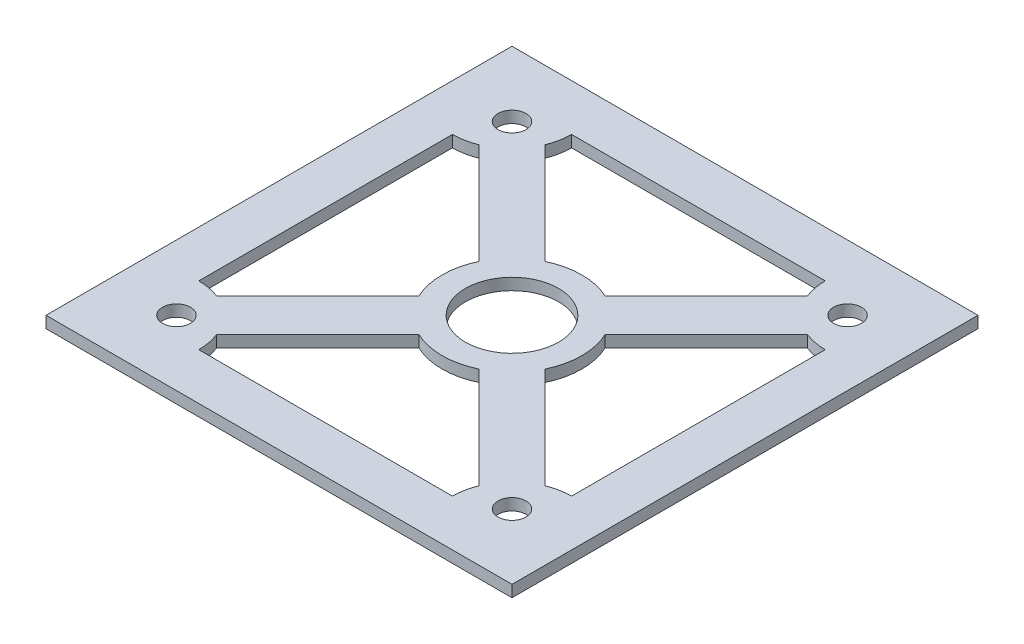
ISO-10303-21;
HEADER;
FILE_DESCRIPTION(('STEP AP214'),'2;1');
FILE_NAME('part.step','',(''),(''),'','','');
FILE_SCHEMA(('AUTOMOTIVE_DESIGN { 1 0 10303 214 1 1 1 1 }'));
ENDSEC;
DATA;
#1=APPLICATION_CONTEXT('core data for automotive mechanical design processes');
#2=APPLICATION_PROTOCOL_DEFINITION('international standard','automotive_design',2000,#1);
#3=PRODUCT_CONTEXT('',#1,'mechanical');
#4=PRODUCT('Part','Part','',(#3));
#5=PRODUCT_RELATED_PRODUCT_CATEGORY('part','',(#4));
#6=PRODUCT_DEFINITION_FORMATION('','',#4);
#7=PRODUCT_DEFINITION_CONTEXT('part definition',#1,'design');
#8=PRODUCT_DEFINITION('design','',#6,#7);
#9=PRODUCT_DEFINITION_SHAPE('','',#8);
#10=(LENGTH_UNIT() NAMED_UNIT(*) SI_UNIT(.MILLI.,.METRE.));
#11=(NAMED_UNIT(*) PLANE_ANGLE_UNIT() SI_UNIT($,.RADIAN.));
#12=(NAMED_UNIT(*) SI_UNIT($,.STERADIAN.) SOLID_ANGLE_UNIT());
#13=UNCERTAINTY_MEASURE_WITH_UNIT(LENGTH_MEASURE(1.E-05),#10,'distance_accuracy_value','');
#14=(GEOMETRIC_REPRESENTATION_CONTEXT(3) GLOBAL_UNCERTAINTY_ASSIGNED_CONTEXT((#13)) GLOBAL_UNIT_ASSIGNED_CONTEXT((#10,
#11,#12)) REPRESENTATION_CONTEXT('',''));
#15=CARTESIAN_POINT('',(0.,0.,0.));
#16=DIRECTION('',(0.,0.,1.));
#17=DIRECTION('',(1.,0.,0.));
#18=AXIS2_PLACEMENT_3D('',#15,#16,#17);
#19=CARTESIAN_POINT('',(0.,0.,0.));
#20=DIRECTION('',(0.,1.,0.));
#21=DIRECTION('',(0.,0.,1.));
#22=AXIS2_PLACEMENT_3D('',#19,#20,#21);
#23=CYLINDRICAL_SURFACE('',#22,15.);
#24=CARTESIAN_POINT('',(0.,2.5,0.));
#25=DIRECTION('',(0.,1.,0.));
#26=DIRECTION('',(0.,0.,1.));
#27=AXIS2_PLACEMENT_3D('',#24,#25,#26);
#28=CIRCLE('',#27,15.);
#29=CARTESIAN_POINT('',(-13.5355339059327,2.5,-6.46446609406726));
#30=VERTEX_POINT('',#29);
#31=CARTESIAN_POINT('',(-13.5355339059327,2.5,6.46446609406726));
#32=VERTEX_POINT('',#31);
#33=EDGE_CURVE('E258',#30,#32,#28,.T.);
#34=ORIENTED_EDGE('',*,*,#33,.F.);
#35=DIRECTION('',(0.,1.,0.));
#36=VECTOR('',#35,1.);
#37=CARTESIAN_POINT('',(-13.5355339059327,0.,-6.46446609406726));
#38=LINE('',#37,#36);
#39=CARTESIAN_POINT('',(-13.5355339059327,0.,-6.46446609406726));
#40=VERTEX_POINT('',#39);
#41=EDGE_CURVE('E249',#30,#40,#38,.F.);
#42=ORIENTED_EDGE('',*,*,#41,.T.);
#43=CARTESIAN_POINT('',(0.,0.,0.));
#44=DIRECTION('',(0.,1.,0.));
#45=DIRECTION('',(0.,0.,1.));
#46=AXIS2_PLACEMENT_3D('',#43,#44,#45);
#47=CIRCLE('',#46,15.);
#48=CARTESIAN_POINT('',(-13.5355339059327,0.,6.46446609406726));
#49=VERTEX_POINT('',#48);
#50=EDGE_CURVE('E290',#40,#49,#47,.T.);
#51=ORIENTED_EDGE('',*,*,#50,.T.);
#52=DIRECTION('',(0.,1.,0.));
#53=VECTOR('',#52,1.);
#54=CARTESIAN_POINT('',(-13.5355339059327,0.,6.46446609406726));
#55=LINE('',#54,#53);
#56=EDGE_CURVE('E470',#32,#49,#55,.F.);
#57=ORIENTED_EDGE('',*,*,#56,.F.);
#58=EDGE_LOOP('',(#34,#42,#51,#57));
#59=FACE_BOUND('',#58,.T.);
#60=ADVANCED_FACE('F47',(#59),#23,.T.);
#61=CARTESIAN_POINT('',(-40.,0.,-40.));
#62=DIRECTION('',(0.,1.,0.));
#63=DIRECTION('',(0.,0.,1.));
#64=AXIS2_PLACEMENT_3D('',#61,#62,#63);
#65=CYLINDRICAL_SURFACE('',#64,12.779930536569);
#66=CARTESIAN_POINT('',(-40.,0.,-40.));
#67=DIRECTION('',(0.,1.,0.));
#68=DIRECTION('',(0.,0.,1.));
#69=AXIS2_PLACEMENT_3D('',#66,#67,#68);
#70=CIRCLE('',#69,12.779930536569);
#71=CARTESIAN_POINT('',(-40.,0.,-27.220069463431));
#72=VERTEX_POINT('',#71);
#73=CARTESIAN_POINT('',(-35.2190856099494,0.,-28.1480177980839));
#74=VERTEX_POINT('',#73);
#75=EDGE_CURVE('E426',#72,#74,#70,.T.);
#76=ORIENTED_EDGE('',*,*,#75,.T.);
#77=DIRECTION('',(0.,1.,0.));
#78=VECTOR('',#77,1.);
#79=CARTESIAN_POINT('',(-35.2190856099494,0.,-28.1480177980839));
#80=LINE('',#79,#78);
#81=CARTESIAN_POINT('',(-35.2190856099494,2.5,-28.1480177980839));
#82=VERTEX_POINT('',#81);
#83=EDGE_CURVE('E56',#74,#82,#80,.T.);
#84=ORIENTED_EDGE('',*,*,#83,.T.);
#85=CARTESIAN_POINT('',(-40.,2.5,-40.));
#86=DIRECTION('',(0.,1.,0.));
#87=DIRECTION('',(0.,0.,1.));
#88=AXIS2_PLACEMENT_3D('',#85,#86,#87);
#89=CIRCLE('',#88,12.779930536569);
#90=CARTESIAN_POINT('',(-40.,2.5,-27.220069463431));
#91=VERTEX_POINT('',#90);
#92=EDGE_CURVE('E430',#91,#82,#89,.T.);
#93=ORIENTED_EDGE('',*,*,#92,.F.);
#94=DIRECTION('',(0.,1.,0.));
#95=VECTOR('',#94,1.);
#96=CARTESIAN_POINT('',(-40.,0.,-27.220069463431));
#97=LINE('',#96,#95);
#98=EDGE_CURVE('E422',#72,#91,#97,.T.);
#99=ORIENTED_EDGE('',*,*,#98,.F.);
#100=EDGE_LOOP('',(#76,#84,#93,#99));
#101=FACE_BOUND('',#100,.T.);
#102=ADVANCED_FACE('F593',(#101),#65,.T.);
#103=DIRECTION('',(0.,1.,0.));
#104=VECTOR('',#103,1.);
#105=CARTESIAN_POINT('',(-6.46446609406726,0.,-13.5355339059327));
#106=LINE('',#105,#104);
#107=CARTESIAN_POINT('',(-6.46446609406726,2.5,-13.5355339059327));
#108=VERTEX_POINT('',#107);
#109=CARTESIAN_POINT('',(-6.46446609406726,0.,-13.5355339059327));
#110=VERTEX_POINT('',#109);
#111=EDGE_CURVE('E232',#108,#110,#106,.F.);
#112=ORIENTED_EDGE('',*,*,#111,.F.);
#113=CARTESIAN_POINT('',(6.46446609406726,2.5,-13.5355339059327));
#114=VERTEX_POINT('',#113);
#115=EDGE_CURVE('E244',#114,#108,#28,.T.);
#116=ORIENTED_EDGE('',*,*,#115,.F.);
#117=DIRECTION('',(0.,1.,0.));
#118=VECTOR('',#117,1.);
#119=CARTESIAN_POINT('',(6.46446609406726,0.,-13.5355339059327));
#120=LINE('',#119,#118);
#121=CARTESIAN_POINT('',(6.46446609406726,0.,-13.5355339059327));
#122=VERTEX_POINT('',#121);
#123=EDGE_CURVE('E493',#114,#122,#120,.F.);
#124=ORIENTED_EDGE('',*,*,#123,.T.);
#125=EDGE_CURVE('E246',#122,#110,#47,.T.);
#126=ORIENTED_EDGE('',*,*,#125,.T.);
#127=EDGE_LOOP('',(#112,#116,#124,#126));
#128=FACE_BOUND('',#127,.T.);
#129=ADVANCED_FACE('F242',(#128),#23,.T.);
#130=CARTESIAN_POINT('',(40.,0.,-40.));
#131=DIRECTION('',(0.,1.,0.));
#132=DIRECTION('',(0.,0.,1.));
#133=AXIS2_PLACEMENT_3D('',#130,#131,#132);
#134=CYLINDRICAL_SURFACE('',#133,12.779930536569);
#135=DIRECTION('',(0.,1.,0.));
#136=VECTOR('',#135,1.);
#137=CARTESIAN_POINT('',(28.1480177980839,0.,-35.2190856099493));
#138=LINE('',#137,#136);
#139=CARTESIAN_POINT('',(28.1480177980839,2.5,-35.2190856099493));
#140=VERTEX_POINT('',#139);
#141=CARTESIAN_POINT('',(28.1480177980839,0.,-35.2190856099493));
#142=VERTEX_POINT('',#141);
#143=EDGE_CURVE('E645',#140,#142,#138,.F.);
#144=ORIENTED_EDGE('',*,*,#143,.F.);
#145=CARTESIAN_POINT('',(40.,2.5,-40.));
#146=DIRECTION('',(0.,1.,0.));
#147=DIRECTION('',(0.,0.,1.));
#148=AXIS2_PLACEMENT_3D('',#145,#146,#147);
#149=CIRCLE('',#148,12.779930536569);
#150=CARTESIAN_POINT('',(27.220069463431,2.5,-40.));
#151=VERTEX_POINT('',#150);
#152=EDGE_CURVE('E451',#140,#151,#149,.F.);
#153=ORIENTED_EDGE('',*,*,#152,.T.);
#154=DIRECTION('',(0.,1.,0.));
#155=VECTOR('',#154,1.);
#156=CARTESIAN_POINT('',(27.220069463431,0.,-40.));
#157=LINE('',#156,#155);
#158=CARTESIAN_POINT('',(27.220069463431,0.,-40.));
#159=VERTEX_POINT('',#158);
#160=EDGE_CURVE('E442',#159,#151,#157,.T.);
#161=ORIENTED_EDGE('',*,*,#160,.F.);
#162=CARTESIAN_POINT('',(40.,0.,-40.));
#163=DIRECTION('',(0.,1.,0.));
#164=DIRECTION('',(0.,0.,1.));
#165=AXIS2_PLACEMENT_3D('',#162,#163,#164);
#166=CIRCLE('',#165,12.779930536569);
#167=EDGE_CURVE('E450',#142,#159,#166,.F.);
#168=ORIENTED_EDGE('',*,*,#167,.F.);
#169=EDGE_LOOP('',(#144,#153,#161,#168));
#170=FACE_BOUND('',#169,.T.);
#171=ADVANCED_FACE('F603',(#170),#134,.T.);
#172=CARTESIAN_POINT('',(-6.46446609406726,2.5,13.5355339059327));
#173=VERTEX_POINT('',#172);
#174=CARTESIAN_POINT('',(6.46446609406726,2.5,13.5355339059327));
#175=VERTEX_POINT('',#174);
#176=EDGE_CURVE('E260',#173,#175,#28,.T.);
#177=ORIENTED_EDGE('',*,*,#176,.F.);
#178=DIRECTION('',(0.,1.,0.));
#179=VECTOR('',#178,1.);
#180=CARTESIAN_POINT('',(-6.46446609406726,0.,13.5355339059327));
#181=LINE('',#180,#179);
#182=CARTESIAN_POINT('',(-6.46446609406726,0.,13.5355339059327));
#183=VERTEX_POINT('',#182);
#184=EDGE_CURVE('E305',#173,#183,#181,.F.);
#185=ORIENTED_EDGE('',*,*,#184,.T.);
#186=CARTESIAN_POINT('',(6.46446609406726,0.,13.5355339059327));
#187=VERTEX_POINT('',#186);
#188=EDGE_CURVE('E264',#183,#187,#47,.T.);
#189=ORIENTED_EDGE('',*,*,#188,.T.);
#190=DIRECTION('',(0.,1.,0.));
#191=VECTOR('',#190,1.);
#192=CARTESIAN_POINT('',(6.46446609406726,0.,13.5355339059327));
#193=LINE('',#192,#191);
#194=EDGE_CURVE('E268',#175,#187,#193,.F.);
#195=ORIENTED_EDGE('',*,*,#194,.F.);
#196=EDGE_LOOP('',(#177,#185,#189,#195));
#197=FACE_BOUND('',#196,.T.);
#198=ADVANCED_FACE('F303',(#197),#23,.T.);
#199=CARTESIAN_POINT('',(-40.,0.,40.));
#200=DIRECTION('',(0.,1.,0.));
#201=DIRECTION('',(0.,0.,1.));
#202=AXIS2_PLACEMENT_3D('',#199,#200,#201);
#203=CYLINDRICAL_SURFACE('',#202,12.779930536569);
#204=DIRECTION('',(0.,1.,0.));
#205=VECTOR('',#204,1.);
#206=CARTESIAN_POINT('',(-28.1480177980839,0.,35.2190856099494));
#207=LINE('',#206,#205);
#208=CARTESIAN_POINT('',(-28.1480177980839,2.5,35.2190856099494));
#209=VERTEX_POINT('',#208);
#210=CARTESIAN_POINT('',(-28.1480177980839,0.,35.2190856099494));
#211=VERTEX_POINT('',#210);
#212=EDGE_CURVE('E297',#209,#211,#207,.F.);
#213=ORIENTED_EDGE('',*,*,#212,.F.);
#214=CARTESIAN_POINT('',(-40.,2.5,40.));
#215=DIRECTION('',(0.,1.,0.));
#216=DIRECTION('',(0.,0.,1.));
#217=AXIS2_PLACEMENT_3D('',#214,#215,#216);
#218=CIRCLE('',#217,12.779930536569);
#219=CARTESIAN_POINT('',(-27.220069463431,2.5,40.));
#220=VERTEX_POINT('',#219);
#221=EDGE_CURVE('E418',#209,#220,#218,.F.);
#222=ORIENTED_EDGE('',*,*,#221,.T.);
#223=DIRECTION('',(0.,1.,0.));
#224=VECTOR('',#223,1.);
#225=CARTESIAN_POINT('',(-27.220069463431,0.,40.));
#226=LINE('',#225,#224);
#227=CARTESIAN_POINT('',(-27.220069463431,0.,40.));
#228=VERTEX_POINT('',#227);
#229=EDGE_CURVE('E405',#228,#220,#226,.T.);
#230=ORIENTED_EDGE('',*,*,#229,.F.);
#231=CARTESIAN_POINT('',(-40.,0.,40.));
#232=DIRECTION('',(0.,1.,0.));
#233=DIRECTION('',(0.,0.,1.));
#234=AXIS2_PLACEMENT_3D('',#231,#232,#233);
#235=CIRCLE('',#234,12.779930536569);
#236=EDGE_CURVE('E417',#211,#228,#235,.F.);
#237=ORIENTED_EDGE('',*,*,#236,.F.);
#238=EDGE_LOOP('',(#213,#222,#230,#237));
#239=FACE_BOUND('',#238,.T.);
#240=ADVANCED_FACE('F605',(#239),#203,.T.);
#241=DIRECTION('',(0.,1.,0.));
#242=VECTOR('',#241,1.);
#243=CARTESIAN_POINT('',(13.5355339059327,0.,-6.46446609406726));
#244=LINE('',#243,#242);
#245=CARTESIAN_POINT('',(13.5355339059327,2.5,-6.46446609406726));
#246=VERTEX_POINT('',#245);
#247=CARTESIAN_POINT('',(13.5355339059327,0.,-6.46446609406726));
#248=VERTEX_POINT('',#247);
#249=EDGE_CURVE('E485',#246,#248,#244,.F.);
#250=ORIENTED_EDGE('',*,*,#249,.F.);
#251=CARTESIAN_POINT('',(13.5355339059327,2.5,6.46446609406726));
#252=VERTEX_POINT('',#251);
#253=EDGE_CURVE('E257',#252,#246,#28,.T.);
#254=ORIENTED_EDGE('',*,*,#253,.F.);
#255=DIRECTION('',(0.,1.,0.));
#256=VECTOR('',#255,1.);
#257=CARTESIAN_POINT('',(13.5355339059327,0.,6.46446609406726));
#258=LINE('',#257,#256);
#259=CARTESIAN_POINT('',(13.5355339059327,0.,6.46446609406726));
#260=VERTEX_POINT('',#259);
#261=EDGE_CURVE('E275',#252,#260,#258,.F.);
#262=ORIENTED_EDGE('',*,*,#261,.T.);
#263=EDGE_CURVE('E286',#260,#248,#47,.T.);
#264=ORIENTED_EDGE('',*,*,#263,.T.);
#265=EDGE_LOOP('',(#250,#254,#262,#264));
#266=FACE_BOUND('',#265,.T.);
#267=ADVANCED_FACE('F49',(#266),#23,.T.);
#268=CARTESIAN_POINT('',(0.,0.,0.));
#269=DIRECTION('',(0.,1.,0.));
#270=DIRECTION('',(0.,0.,1.));
#271=AXIS2_PLACEMENT_3D('',#268,#269,#270);
#272=PLANE('',#271);
#273=CARTESIAN_POINT('',(0.,0.,0.));
#274=DIRECTION('',(0.,1.,0.));
#275=DIRECTION('',(0.,0.,1.));
#276=AXIS2_PLACEMENT_3D('',#273,#274,#275);
#277=CIRCLE('',#276,10.);
#278=CARTESIAN_POINT('',(0.,0.,10.));
#279=VERTEX_POINT('',#278);
#280=EDGE_CURVE('E549',#279,#279,#277,.T.);
#281=ORIENTED_EDGE('',*,*,#280,.T.);
#282=EDGE_LOOP('',(#281));
#283=FACE_BOUND('',#282,.T.);
#284=CARTESIAN_POINT('',(-36.,0.,-36.));
#285=DIRECTION('',(0.,1.,0.));
#286=DIRECTION('',(0.,0.,-1.));
#287=AXIS2_PLACEMENT_3D('',#284,#285,#286);
#288=CIRCLE('',#287,3.);
#289=CARTESIAN_POINT('',(-36.,0.,-39.));
#290=VERTEX_POINT('',#289);
#291=EDGE_CURVE('E538',#290,#290,#288,.T.);
#292=ORIENTED_EDGE('',*,*,#291,.T.);
#293=EDGE_LOOP('',(#292));
#294=FACE_BOUND('',#293,.T.);
#295=CARTESIAN_POINT('',(36.,0.,36.));
#296=DIRECTION('',(0.,1.,0.));
#297=DIRECTION('',(0.,0.,-1.));
#298=AXIS2_PLACEMENT_3D('',#295,#296,#297);
#299=CIRCLE('',#298,3.);
#300=CARTESIAN_POINT('',(36.,0.,33.));
#301=VERTEX_POINT('',#300);
#302=EDGE_CURVE('E529',#301,#301,#299,.T.);
#303=ORIENTED_EDGE('',*,*,#302,.T.);
#304=EDGE_LOOP('',(#303));
#305=FACE_BOUND('',#304,.T.);
#306=CARTESIAN_POINT('',(-36.,0.,36.));
#307=DIRECTION('',(0.,1.,0.));
#308=DIRECTION('',(0.,0.,1.));
#309=AXIS2_PLACEMENT_3D('',#306,#307,#308);
#310=CIRCLE('',#309,3.);
#311=CARTESIAN_POINT('',(-36.,0.,39.));
#312=VERTEX_POINT('',#311);
#313=EDGE_CURVE('E545',#312,#312,#310,.T.);
#314=ORIENTED_EDGE('',*,*,#313,.T.);
#315=EDGE_LOOP('',(#314));
#316=FACE_BOUND('',#315,.T.);
#317=CARTESIAN_POINT('',(36.,0.,-36.));
#318=DIRECTION('',(0.,1.,0.));
#319=DIRECTION('',(0.,0.,1.));
#320=AXIS2_PLACEMENT_3D('',#317,#318,#319);
#321=CIRCLE('',#320,3.);
#322=CARTESIAN_POINT('',(36.,0.,-33.));
#323=VERTEX_POINT('',#322);
#324=EDGE_CURVE('E237',#323,#323,#321,.T.);
#325=ORIENTED_EDGE('',*,*,#324,.T.);
#326=EDGE_LOOP('',(#325));
#327=FACE_BOUND('',#326,.T.);
#328=ORIENTED_EDGE('',*,*,#50,.F.);
#329=DIRECTION('',(-0.707106781186548,0.,-0.707106781186547));
#330=VECTOR('',#329,1.);
#331=CARTESIAN_POINT('',(-11.2855339059327,0.,-4.21446609406726));
#332=LINE('',#331,#330);
#333=EDGE_CURVE('E512',#40,#74,#332,.T.);
#334=ORIENTED_EDGE('',*,*,#333,.T.);
#335=ORIENTED_EDGE('',*,*,#75,.F.);
#336=DIRECTION('',(0.,0.,-1.));
#337=VECTOR('',#336,1.);
#338=CARTESIAN_POINT('',(-40.,0.,0.));
#339=LINE('',#338,#337);
#340=CARTESIAN_POINT('',(-40.,0.,27.220069463431));
#341=VERTEX_POINT('',#340);
#342=EDGE_CURVE('E340',#341,#72,#339,.T.);
#343=ORIENTED_EDGE('',*,*,#342,.F.);
#344=CARTESIAN_POINT('',(-35.2190856099494,0.,28.1480177980839));
#345=VERTEX_POINT('',#344);
#346=EDGE_CURVE('E410',#341,#345,#235,.F.);
#347=ORIENTED_EDGE('',*,*,#346,.T.);
#348=DIRECTION('',(-0.707106781186548,0.,0.707106781186547));
#349=VECTOR('',#348,1.);
#350=CARTESIAN_POINT('',(-11.2855339059327,0.,4.21446609406726));
#351=LINE('',#350,#349);
#352=EDGE_CURVE('E480',#49,#345,#351,.T.);
#353=ORIENTED_EDGE('',*,*,#352,.F.);
#354=EDGE_LOOP('',(#328,#334,#335,#343,#347,#353));
#355=FACE_BOUND('',#354,.T.);
#356=DIRECTION('',(-0.707106781186548,0.,-0.707106781186547));
#357=VECTOR('',#356,1.);
#358=CARTESIAN_POINT('',(-4.21446609406726,0.,-11.2855339059327));
#359=LINE('',#358,#357);
#360=CARTESIAN_POINT('',(-28.1480177980839,0.,-35.2190856099493));
#361=VERTEX_POINT('',#360);
#362=EDGE_CURVE('E514',#110,#361,#359,.T.);
#363=ORIENTED_EDGE('',*,*,#362,.F.);
#364=ORIENTED_EDGE('',*,*,#125,.F.);
#365=DIRECTION('',(0.707106781186548,0.,-0.707106781186547));
#366=VECTOR('',#365,1.);
#367=CARTESIAN_POINT('',(4.21446609406726,0.,-11.2855339059327));
#368=LINE('',#367,#366);
#369=EDGE_CURVE('E496',#122,#142,#368,.T.);
#370=ORIENTED_EDGE('',*,*,#369,.T.);
#371=ORIENTED_EDGE('',*,*,#167,.T.);
#372=DIRECTION('',(1.,0.,0.));
#373=VECTOR('',#372,1.);
#374=CARTESIAN_POINT('',(0.,0.,-40.));
#375=LINE('',#374,#373);
#376=CARTESIAN_POINT('',(-27.220069463431,0.,-40.));
#377=VERTEX_POINT('',#376);
#378=EDGE_CURVE('E345',#377,#159,#375,.T.);
#379=ORIENTED_EDGE('',*,*,#378,.F.);
#380=EDGE_CURVE('E433',#361,#377,#70,.T.);
#381=ORIENTED_EDGE('',*,*,#380,.F.);
#382=EDGE_LOOP('',(#363,#364,#370,#371,#379,#381));
#383=FACE_BOUND('',#382,.T.);
#384=DIRECTION('',(0.707106781186548,0.,-0.707106781186547));
#385=VECTOR('',#384,1.);
#386=CARTESIAN_POINT('',(11.2855339059327,0.,-4.21446609406726));
#387=LINE('',#386,#385);
#388=CARTESIAN_POINT('',(35.2190856099494,0.,-28.1480177980839));
#389=VERTEX_POINT('',#388);
#390=EDGE_CURVE('E499',#248,#389,#387,.T.);
#391=ORIENTED_EDGE('',*,*,#390,.F.);
#392=ORIENTED_EDGE('',*,*,#263,.F.);
#393=DIRECTION('',(0.707106781186548,0.,0.707106781186547));
#394=VECTOR('',#393,1.);
#395=CARTESIAN_POINT('',(6.03553390593274,0.,-1.03553390593274));
#396=LINE('',#395,#394);
#397=CARTESIAN_POINT('',(35.2190856099494,0.,28.1480177980839));
#398=VERTEX_POINT('',#397);
#399=EDGE_CURVE('E283',#260,#398,#396,.T.);
#400=ORIENTED_EDGE('',*,*,#399,.T.);
#401=CARTESIAN_POINT('',(40.,0.,40.));
#402=DIRECTION('',(0.,1.,0.));
#403=DIRECTION('',(0.,0.,1.));
#404=AXIS2_PLACEMENT_3D('',#401,#402,#403);
#405=CIRCLE('',#404,12.779930536569);
#406=CARTESIAN_POINT('',(40.,0.,27.220069463431));
#407=VERTEX_POINT('',#406);
#408=EDGE_CURVE('E459',#407,#398,#405,.T.);
#409=ORIENTED_EDGE('',*,*,#408,.F.);
#410=DIRECTION('',(0.,0.,1.));
#411=VECTOR('',#410,1.);
#412=CARTESIAN_POINT('',(40.,0.,0.));
#413=LINE('',#412,#411);
#414=CARTESIAN_POINT('',(40.,0.,-27.220069463431));
#415=VERTEX_POINT('',#414);
#416=EDGE_CURVE('E331',#415,#407,#413,.T.);
#417=ORIENTED_EDGE('',*,*,#416,.F.);
#418=EDGE_CURVE('E443',#415,#389,#166,.F.);
#419=ORIENTED_EDGE('',*,*,#418,.T.);
#420=EDGE_LOOP('',(#391,#392,#400,#409,#417,#419));
#421=FACE_BOUND('',#420,.T.);
#422=ORIENTED_EDGE('',*,*,#188,.F.);
#423=DIRECTION('',(-0.707106781186548,0.,0.707106781186547));
#424=VECTOR('',#423,1.);
#425=CARTESIAN_POINT('',(-4.21446609406726,0.,11.2855339059327));
#426=LINE('',#425,#424);
#427=EDGE_CURVE('E310',#183,#211,#426,.T.);
#428=ORIENTED_EDGE('',*,*,#427,.T.);
#429=ORIENTED_EDGE('',*,*,#236,.T.);
#430=DIRECTION('',(-1.,0.,0.));
#431=VECTOR('',#430,1.);
#432=CARTESIAN_POINT('',(0.,0.,40.));
#433=LINE('',#432,#431);
#434=CARTESIAN_POINT('',(27.220069463431,0.,40.));
#435=VERTEX_POINT('',#434);
#436=EDGE_CURVE('E334',#435,#228,#433,.T.);
#437=ORIENTED_EDGE('',*,*,#436,.F.);
#438=CARTESIAN_POINT('',(28.1480177980839,0.,35.2190856099494));
#439=VERTEX_POINT('',#438);
#440=EDGE_CURVE('E314',#439,#435,#405,.T.);
#441=ORIENTED_EDGE('',*,*,#440,.F.);
#442=DIRECTION('',(0.707106781186548,0.,0.707106781186547));
#443=VECTOR('',#442,1.);
#444=CARTESIAN_POINT('',(-1.03553390593274,0.,6.03553390593274));
#445=LINE('',#444,#443);
#446=EDGE_CURVE('E312',#187,#439,#445,.T.);
#447=ORIENTED_EDGE('',*,*,#446,.F.);
#448=EDGE_LOOP('',(#422,#428,#429,#437,#441,#447));
#449=FACE_BOUND('',#448,.T.);
#450=DIRECTION('',(0.,0.,-1.));
#451=VECTOR('',#450,1.);
#452=CARTESIAN_POINT('',(50.,0.,50.));
#453=LINE('',#452,#451);
#454=CARTESIAN_POINT('',(50.,0.,50.));
#455=VERTEX_POINT('',#454);
#456=CARTESIAN_POINT('',(50.,0.,-50.));
#457=VERTEX_POINT('',#456);
#458=EDGE_CURVE('E376',#455,#457,#453,.T.);
#459=ORIENTED_EDGE('',*,*,#458,.F.);
#460=DIRECTION('',(1.,0.,0.));
#461=VECTOR('',#460,1.);
#462=CARTESIAN_POINT('',(-50.,0.,50.));
#463=LINE('',#462,#461);
#464=CARTESIAN_POINT('',(-50.,0.,50.));
#465=VERTEX_POINT('',#464);
#466=EDGE_CURVE('E366',#465,#455,#463,.T.);
#467=ORIENTED_EDGE('',*,*,#466,.F.);
#468=DIRECTION('',(0.,0.,1.));
#469=VECTOR('',#468,1.);
#470=CARTESIAN_POINT('',(-50.,0.,50.));
#471=LINE('',#470,#469);
#472=CARTESIAN_POINT('',(-50.,0.,-50.));
#473=VERTEX_POINT('',#472);
#474=EDGE_CURVE('E370',#473,#465,#471,.T.);
#475=ORIENTED_EDGE('',*,*,#474,.F.);
#476=DIRECTION('',(-1.,0.,0.));
#477=VECTOR('',#476,1.);
#478=CARTESIAN_POINT('',(-50.,0.,-50.));
#479=LINE('',#478,#477);
#480=EDGE_CURVE('E373',#457,#473,#479,.T.);
#481=ORIENTED_EDGE('',*,*,#480,.F.);
#482=EDGE_LOOP('',(#459,#467,#475,#481));
#483=FACE_BOUND('',#482,.T.);
#484=ADVANCED_FACE('F308',(#283,#294,#305,#316,#327,#355,#383,#421,#449,#483),#272,.F.);
#485=CARTESIAN_POINT('',(0.,2.5,0.));
#486=DIRECTION('',(0.,1.,0.));
#487=DIRECTION('',(0.,0.,1.));
#488=AXIS2_PLACEMENT_3D('',#485,#486,#487);
#489=PLANE('',#488);
#490=CARTESIAN_POINT('',(0.,2.5,0.));
#491=DIRECTION('',(0.,1.,0.));
#492=DIRECTION('',(0.,0.,1.));
#493=AXIS2_PLACEMENT_3D('',#490,#491,#492);
#494=CIRCLE('',#493,10.);
#495=CARTESIAN_POINT('',(0.,2.5,10.));
#496=VERTEX_POINT('',#495);
#497=EDGE_CURVE('E556',#496,#496,#494,.T.);
#498=ORIENTED_EDGE('',*,*,#497,.F.);
#499=EDGE_LOOP('',(#498));
#500=FACE_BOUND('',#499,.T.);
#501=CARTESIAN_POINT('',(-36.,2.5,-36.));
#502=DIRECTION('',(0.,1.,0.));
#503=DIRECTION('',(0.,0.,-1.));
#504=AXIS2_PLACEMENT_3D('',#501,#502,#503);
#505=CIRCLE('',#504,3.);
#506=CARTESIAN_POINT('',(-36.,2.5,-39.));
#507=VERTEX_POINT('',#506);
#508=EDGE_CURVE('E525',#507,#507,#505,.T.);
#509=ORIENTED_EDGE('',*,*,#508,.F.);
#510=EDGE_LOOP('',(#509));
#511=FACE_BOUND('',#510,.T.);
#512=CARTESIAN_POINT('',(36.,2.5,36.));
#513=DIRECTION('',(0.,1.,0.));
#514=DIRECTION('',(0.,0.,-1.));
#515=AXIS2_PLACEMENT_3D('',#512,#513,#514);
#516=CIRCLE('',#515,3.);
#517=CARTESIAN_POINT('',(36.,2.5,33.));
#518=VERTEX_POINT('',#517);
#519=EDGE_CURVE('E533',#518,#518,#516,.T.);
#520=ORIENTED_EDGE('',*,*,#519,.F.);
#521=EDGE_LOOP('',(#520));
#522=FACE_BOUND('',#521,.T.);
#523=CARTESIAN_POINT('',(-36.,2.5,36.));
#524=DIRECTION('',(0.,1.,0.));
#525=DIRECTION('',(0.,0.,1.));
#526=AXIS2_PLACEMENT_3D('',#523,#524,#525);
#527=CIRCLE('',#526,3.);
#528=CARTESIAN_POINT('',(-36.,2.5,39.));
#529=VERTEX_POINT('',#528);
#530=EDGE_CURVE('E534',#529,#529,#527,.T.);
#531=ORIENTED_EDGE('',*,*,#530,.F.);
#532=EDGE_LOOP('',(#531));
#533=FACE_BOUND('',#532,.T.);
#534=CARTESIAN_POINT('',(36.,2.5,-36.));
#535=DIRECTION('',(0.,1.,0.));
#536=DIRECTION('',(0.,0.,1.));
#537=AXIS2_PLACEMENT_3D('',#534,#535,#536);
#538=CIRCLE('',#537,3.);
#539=CARTESIAN_POINT('',(36.,2.5,-33.));
#540=VERTEX_POINT('',#539);
#541=EDGE_CURVE('E521',#540,#540,#538,.T.);
#542=ORIENTED_EDGE('',*,*,#541,.F.);
#543=EDGE_LOOP('',(#542));
#544=FACE_BOUND('',#543,.T.);
#545=DIRECTION('',(-0.707106781186548,0.,-0.707106781186547));
#546=VECTOR('',#545,1.);
#547=CARTESIAN_POINT('',(-11.2855339059327,2.5,-4.21446609406726));
#548=LINE('',#547,#546);
#549=EDGE_CURVE('E63',#30,#82,#548,.T.);
#550=ORIENTED_EDGE('',*,*,#549,.F.);
#551=ORIENTED_EDGE('',*,*,#33,.T.);
#552=DIRECTION('',(-0.707106781186548,0.,0.707106781186547));
#553=VECTOR('',#552,1.);
#554=CARTESIAN_POINT('',(-11.2855339059327,2.5,4.21446609406726));
#555=LINE('',#554,#553);
#556=CARTESIAN_POINT('',(-35.2190856099494,2.5,28.1480177980839));
#557=VERTEX_POINT('',#556);
#558=EDGE_CURVE('E481',#32,#557,#555,.T.);
#559=ORIENTED_EDGE('',*,*,#558,.T.);
#560=CARTESIAN_POINT('',(-40.,2.5,27.220069463431));
#561=VERTEX_POINT('',#560);
#562=EDGE_CURVE('E414',#561,#557,#218,.F.);
#563=ORIENTED_EDGE('',*,*,#562,.F.);
#564=DIRECTION('',(0.,0.,1.));
#565=VECTOR('',#564,1.);
#566=CARTESIAN_POINT('',(-40.,2.5,40.));
#567=LINE('',#566,#565);
#568=EDGE_CURVE('E395',#91,#561,#567,.T.);
#569=ORIENTED_EDGE('',*,*,#568,.F.);
#570=ORIENTED_EDGE('',*,*,#92,.T.);
#571=EDGE_LOOP('',(#550,#551,#559,#563,#569,#570));
#572=FACE_BOUND('',#571,.T.);
#573=ORIENTED_EDGE('',*,*,#115,.T.);
#574=DIRECTION('',(-0.707106781186548,0.,-0.707106781186547));
#575=VECTOR('',#574,1.);
#576=CARTESIAN_POINT('',(-4.21446609406726,2.5,-11.2855339059327));
#577=LINE('',#576,#575);
#578=CARTESIAN_POINT('',(-28.1480177980839,2.5,-35.2190856099493));
#579=VERTEX_POINT('',#578);
#580=EDGE_CURVE('E71',#108,#579,#577,.T.);
#581=ORIENTED_EDGE('',*,*,#580,.T.);
#582=CARTESIAN_POINT('',(-27.220069463431,2.5,-40.));
#583=VERTEX_POINT('',#582);
#584=EDGE_CURVE('E434',#579,#583,#89,.T.);
#585=ORIENTED_EDGE('',*,*,#584,.T.);
#586=DIRECTION('',(-1.,0.,0.));
#587=VECTOR('',#586,1.);
#588=CARTESIAN_POINT('',(-40.,2.5,-40.));
#589=LINE('',#588,#587);
#590=EDGE_CURVE('E398',#151,#583,#589,.T.);
#591=ORIENTED_EDGE('',*,*,#590,.F.);
#592=ORIENTED_EDGE('',*,*,#152,.F.);
#593=DIRECTION('',(0.707106781186548,0.,-0.707106781186547));
#594=VECTOR('',#593,1.);
#595=CARTESIAN_POINT('',(4.21446609406726,2.5,-11.2855339059327));
#596=LINE('',#595,#594);
#597=EDGE_CURVE('E254',#114,#140,#596,.T.);
#598=ORIENTED_EDGE('',*,*,#597,.F.);
#599=EDGE_LOOP('',(#573,#581,#585,#591,#592,#598));
#600=FACE_BOUND('',#599,.T.);
#601=ORIENTED_EDGE('',*,*,#253,.T.);
#602=DIRECTION('',(0.707106781186548,0.,-0.707106781186547));
#603=VECTOR('',#602,1.);
#604=CARTESIAN_POINT('',(11.2855339059327,2.5,-4.21446609406726));
#605=LINE('',#604,#603);
#606=CARTESIAN_POINT('',(35.2190856099494,2.5,-28.1480177980839));
#607=VERTEX_POINT('',#606);
#608=EDGE_CURVE('E248',#246,#607,#605,.T.);
#609=ORIENTED_EDGE('',*,*,#608,.T.);
#610=CARTESIAN_POINT('',(40.,2.5,-27.220069463431));
#611=VERTEX_POINT('',#610);
#612=EDGE_CURVE('E447',#611,#607,#149,.F.);
#613=ORIENTED_EDGE('',*,*,#612,.F.);
#614=DIRECTION('',(0.,0.,-1.));
#615=VECTOR('',#614,1.);
#616=CARTESIAN_POINT('',(40.,2.5,40.));
#617=LINE('',#616,#615);
#618=CARTESIAN_POINT('',(40.,2.5,27.220069463431));
#619=VERTEX_POINT('',#618);
#620=EDGE_CURVE('E402',#619,#611,#617,.T.);
#621=ORIENTED_EDGE('',*,*,#620,.F.);
#622=CARTESIAN_POINT('',(40.,2.5,40.));
#623=DIRECTION('',(0.,1.,0.));
#624=DIRECTION('',(0.,0.,1.));
#625=AXIS2_PLACEMENT_3D('',#622,#623,#624);
#626=CIRCLE('',#625,12.779930536569);
#627=CARTESIAN_POINT('',(35.2190856099494,2.5,28.1480177980839));
#628=VERTEX_POINT('',#627);
#629=EDGE_CURVE('E463',#619,#628,#626,.T.);
#630=ORIENTED_EDGE('',*,*,#629,.T.);
#631=DIRECTION('',(0.707106781186548,0.,0.707106781186547));
#632=VECTOR('',#631,1.);
#633=CARTESIAN_POINT('',(6.03553390593274,2.5,-1.03553390593274));
#634=LINE('',#633,#632);
#635=EDGE_CURVE('E317',#252,#628,#634,.T.);
#636=ORIENTED_EDGE('',*,*,#635,.F.);
#637=EDGE_LOOP('',(#601,#609,#613,#621,#630,#636));
#638=FACE_BOUND('',#637,.T.);
#639=DIRECTION('',(-0.707106781186548,0.,0.707106781186547));
#640=VECTOR('',#639,1.);
#641=CARTESIAN_POINT('',(-4.21446609406726,2.5,11.2855339059327));
#642=LINE('',#641,#640);
#643=EDGE_CURVE('E476',#173,#209,#642,.T.);
#644=ORIENTED_EDGE('',*,*,#643,.F.);
#645=ORIENTED_EDGE('',*,*,#176,.T.);
#646=DIRECTION('',(0.707106781186548,0.,0.707106781186547));
#647=VECTOR('',#646,1.);
#648=CARTESIAN_POINT('',(-1.03553390593274,2.5,6.03553390593274));
#649=LINE('',#648,#647);
#650=CARTESIAN_POINT('',(28.1480177980839,2.5,35.2190856099494));
#651=VERTEX_POINT('',#650);
#652=EDGE_CURVE('E324',#175,#651,#649,.T.);
#653=ORIENTED_EDGE('',*,*,#652,.T.);
#654=CARTESIAN_POINT('',(27.220069463431,2.5,40.));
#655=VERTEX_POINT('',#654);
#656=EDGE_CURVE('E467',#651,#655,#626,.T.);
#657=ORIENTED_EDGE('',*,*,#656,.T.);
#658=DIRECTION('',(1.,0.,0.));
#659=VECTOR('',#658,1.);
#660=CARTESIAN_POINT('',(-40.,2.5,40.));
#661=LINE('',#660,#659);
#662=EDGE_CURVE('E380',#220,#655,#661,.T.);
#663=ORIENTED_EDGE('',*,*,#662,.F.);
#664=ORIENTED_EDGE('',*,*,#221,.F.);
#665=EDGE_LOOP('',(#644,#645,#653,#657,#663,#664));
#666=FACE_BOUND('',#665,.T.);
#667=DIRECTION('',(0.,0.,-1.));
#668=VECTOR('',#667,1.);
#669=CARTESIAN_POINT('',(50.,2.5,50.));
#670=LINE('',#669,#668);
#671=CARTESIAN_POINT('',(50.,2.5,50.));
#672=VERTEX_POINT('',#671);
#673=CARTESIAN_POINT('',(50.,2.5,-50.));
#674=VERTEX_POINT('',#673);
#675=EDGE_CURVE('E369',#672,#674,#670,.T.);
#676=ORIENTED_EDGE('',*,*,#675,.T.);
#677=DIRECTION('',(-1.,0.,0.));
#678=VECTOR('',#677,1.);
#679=CARTESIAN_POINT('',(-50.,2.5,-50.));
#680=LINE('',#679,#678);
#681=CARTESIAN_POINT('',(-50.,2.5,-50.));
#682=VERTEX_POINT('',#681);
#683=EDGE_CURVE('E386',#674,#682,#680,.T.);
#684=ORIENTED_EDGE('',*,*,#683,.T.);
#685=DIRECTION('',(0.,0.,1.));
#686=VECTOR('',#685,1.);
#687=CARTESIAN_POINT('',(-50.,2.5,50.));
#688=LINE('',#687,#686);
#689=CARTESIAN_POINT('',(-50.,2.5,50.));
#690=VERTEX_POINT('',#689);
#691=EDGE_CURVE('E383',#682,#690,#688,.T.);
#692=ORIENTED_EDGE('',*,*,#691,.T.);
#693=DIRECTION('',(1.,0.,0.));
#694=VECTOR('',#693,1.);
#695=CARTESIAN_POINT('',(-50.,2.5,50.));
#696=LINE('',#695,#694);
#697=EDGE_CURVE('E365',#690,#672,#696,.T.);
#698=ORIENTED_EDGE('',*,*,#697,.T.);
#699=EDGE_LOOP('',(#676,#684,#692,#698));
#700=FACE_BOUND('',#699,.T.);
#701=ADVANCED_FACE('F251',(#500,#511,#522,#533,#544,#572,#600,#638,#666,#700),#489,.T.);
#702=CARTESIAN_POINT('',(-1.03553390593274,0.,6.03553390593274));
#703=DIRECTION('',(-0.707106781186547,0.,0.707106781186548));
#704=DIRECTION('',(0.707106781186548,0.,0.707106781186547));
#705=AXIS2_PLACEMENT_3D('',#702,#703,#704);
#706=PLANE('',#705);
#707=DIRECTION('',(0.,1.,0.));
#708=VECTOR('',#707,1.);
#709=CARTESIAN_POINT('',(28.1480177980839,0.,35.2190856099494));
#710=LINE('',#709,#708);
#711=EDGE_CURVE('E326',#651,#439,#710,.F.);
#712=ORIENTED_EDGE('',*,*,#711,.F.);
#713=ORIENTED_EDGE('',*,*,#652,.F.);
#714=ORIENTED_EDGE('',*,*,#194,.T.);
#715=ORIENTED_EDGE('',*,*,#446,.T.);
#716=EDGE_LOOP('',(#712,#713,#714,#715));
#717=FACE_BOUND('',#716,.T.);
#718=ADVANCED_FACE('F566',(#717),#706,.T.);
#719=CARTESIAN_POINT('',(6.03553390593274,0.,-1.03553390593274));
#720=DIRECTION('',(-0.707106781186547,0.,0.707106781186548));
#721=DIRECTION('',(0.707106781186548,0.,0.707106781186547));
#722=AXIS2_PLACEMENT_3D('',#719,#720,#721);
#723=PLANE('',#722);
#724=ORIENTED_EDGE('',*,*,#635,.T.);
#725=DIRECTION('',(0.,1.,0.));
#726=VECTOR('',#725,1.);
#727=CARTESIAN_POINT('',(35.2190856099494,0.,28.1480177980839));
#728=LINE('',#727,#726);
#729=EDGE_CURVE('E289',#628,#398,#728,.F.);
#730=ORIENTED_EDGE('',*,*,#729,.T.);
#731=ORIENTED_EDGE('',*,*,#399,.F.);
#732=ORIENTED_EDGE('',*,*,#261,.F.);
#733=EDGE_LOOP('',(#724,#730,#731,#732));
#734=FACE_BOUND('',#733,.T.);
#735=ADVANCED_FACE('F654',(#734),#723,.F.);
#736=CARTESIAN_POINT('',(40.,0.,40.));
#737=DIRECTION('',(0.,1.,0.));
#738=DIRECTION('',(0.,0.,1.));
#739=AXIS2_PLACEMENT_3D('',#736,#737,#738);
#740=CYLINDRICAL_SURFACE('',#739,12.779930536569);
#741=ORIENTED_EDGE('',*,*,#729,.F.);
#742=ORIENTED_EDGE('',*,*,#629,.F.);
#743=DIRECTION('',(0.,1.,0.));
#744=VECTOR('',#743,1.);
#745=CARTESIAN_POINT('',(40.,0.,27.220069463431));
#746=LINE('',#745,#744);
#747=EDGE_CURVE('E455',#407,#619,#746,.T.);
#748=ORIENTED_EDGE('',*,*,#747,.F.);
#749=ORIENTED_EDGE('',*,*,#408,.T.);
#750=EDGE_LOOP('',(#741,#742,#748,#749));
#751=FACE_BOUND('',#750,.T.);
#752=ADVANCED_FACE('F634',(#751),#740,.T.);
#753=CARTESIAN_POINT('',(40.,-1.5,40.));
#754=DIRECTION('',(1.,0.,0.));
#755=DIRECTION('',(0.,0.,-1.));
#756=AXIS2_PLACEMENT_3D('',#753,#754,#755);
#757=PLANE('',#756);
#758=ORIENTED_EDGE('',*,*,#416,.T.);
#759=ORIENTED_EDGE('',*,*,#747,.T.);
#760=ORIENTED_EDGE('',*,*,#620,.T.);
#761=DIRECTION('',(0.,1.,0.));
#762=VECTOR('',#761,1.);
#763=CARTESIAN_POINT('',(40.,0.,-27.220069463431));
#764=LINE('',#763,#762);
#765=EDGE_CURVE('E438',#415,#611,#764,.T.);
#766=ORIENTED_EDGE('',*,*,#765,.F.);
#767=EDGE_LOOP('',(#758,#759,#760,#766));
#768=FACE_BOUND('',#767,.T.);
#769=ADVANCED_FACE('F661',(#768),#757,.F.);
#770=CARTESIAN_POINT('',(-40.,-1.5,-40.));
#771=DIRECTION('',(0.,0.,-1.));
#772=DIRECTION('',(-1.,0.,0.));
#773=AXIS2_PLACEMENT_3D('',#770,#771,#772);
#774=PLANE('',#773);
#775=ORIENTED_EDGE('',*,*,#160,.T.);
#776=ORIENTED_EDGE('',*,*,#590,.T.);
#777=DIRECTION('',(0.,1.,0.));
#778=VECTOR('',#777,1.);
#779=CARTESIAN_POINT('',(-27.220069463431,0.,-40.));
#780=LINE('',#779,#778);
#781=EDGE_CURVE('E425',#377,#583,#780,.T.);
#782=ORIENTED_EDGE('',*,*,#781,.F.);
#783=ORIENTED_EDGE('',*,*,#378,.T.);
#784=EDGE_LOOP('',(#775,#776,#782,#783));
#785=FACE_BOUND('',#784,.T.);
#786=ADVANCED_FACE('F683',(#785),#774,.F.);
#787=CARTESIAN_POINT('',(-40.,-1.5,40.));
#788=DIRECTION('',(0.,0.,1.));
#789=DIRECTION('',(1.,0.,0.));
#790=AXIS2_PLACEMENT_3D('',#787,#788,#789);
#791=PLANE('',#790);
#792=ORIENTED_EDGE('',*,*,#662,.T.);
#793=DIRECTION('',(0.,1.,0.));
#794=VECTOR('',#793,1.);
#795=CARTESIAN_POINT('',(27.220069463431,0.,40.));
#796=LINE('',#795,#794);
#797=EDGE_CURVE('E458',#435,#655,#796,.T.);
#798=ORIENTED_EDGE('',*,*,#797,.F.);
#799=ORIENTED_EDGE('',*,*,#436,.T.);
#800=ORIENTED_EDGE('',*,*,#229,.T.);
#801=EDGE_LOOP('',(#792,#798,#799,#800));
#802=FACE_BOUND('',#801,.T.);
#803=ADVANCED_FACE('F686',(#802),#791,.F.);
#804=CARTESIAN_POINT('',(-40.,-1.5,40.));
#805=DIRECTION('',(-1.,0.,0.));
#806=DIRECTION('',(0.,0.,1.));
#807=AXIS2_PLACEMENT_3D('',#804,#805,#806);
#808=PLANE('',#807);
#809=ORIENTED_EDGE('',*,*,#342,.T.);
#810=ORIENTED_EDGE('',*,*,#98,.T.);
#811=ORIENTED_EDGE('',*,*,#568,.T.);
#812=DIRECTION('',(0.,1.,0.));
#813=VECTOR('',#812,1.);
#814=CARTESIAN_POINT('',(-40.,0.,27.220069463431));
#815=LINE('',#814,#813);
#816=EDGE_CURVE('E406',#341,#561,#815,.T.);
#817=ORIENTED_EDGE('',*,*,#816,.F.);
#818=EDGE_LOOP('',(#809,#810,#811,#817));
#819=FACE_BOUND('',#818,.T.);
#820=ADVANCED_FACE('F668',(#819),#808,.F.);
#821=CARTESIAN_POINT('',(50.,2.5,50.));
#822=DIRECTION('',(-1.,0.,0.));
#823=DIRECTION('',(0.,0.,1.));
#824=AXIS2_PLACEMENT_3D('',#821,#822,#823);
#825=PLANE('',#824);
#826=ORIENTED_EDGE('',*,*,#458,.T.);
#827=DIRECTION('',(0.,-1.,0.));
#828=VECTOR('',#827,1.);
#829=CARTESIAN_POINT('',(50.,2.5,-50.));
#830=LINE('',#829,#828);
#831=EDGE_CURVE('E349',#674,#457,#830,.T.);
#832=ORIENTED_EDGE('',*,*,#831,.F.);
#833=ORIENTED_EDGE('',*,*,#675,.F.);
#834=DIRECTION('',(0.,-1.,0.));
#835=VECTOR('',#834,1.);
#836=CARTESIAN_POINT('',(50.,2.5,50.));
#837=LINE('',#836,#835);
#838=EDGE_CURVE('E361',#672,#455,#837,.T.);
#839=ORIENTED_EDGE('',*,*,#838,.T.);
#840=EDGE_LOOP('',(#826,#832,#833,#839));
#841=FACE_BOUND('',#840,.T.);
#842=ADVANCED_FACE('F664',(#841),#825,.F.);
#843=CARTESIAN_POINT('',(-50.,2.5,-50.));
#844=DIRECTION('',(0.,0.,1.));
#845=DIRECTION('',(1.,0.,0.));
#846=AXIS2_PLACEMENT_3D('',#843,#844,#845);
#847=PLANE('',#846);
#848=ORIENTED_EDGE('',*,*,#480,.T.);
#849=DIRECTION('',(0.,-1.,0.));
#850=VECTOR('',#849,1.);
#851=CARTESIAN_POINT('',(-50.,2.5,-50.));
#852=LINE('',#851,#850);
#853=EDGE_CURVE('E353',#682,#473,#852,.T.);
#854=ORIENTED_EDGE('',*,*,#853,.F.);
#855=ORIENTED_EDGE('',*,*,#683,.F.);
#856=ORIENTED_EDGE('',*,*,#831,.T.);
#857=EDGE_LOOP('',(#848,#854,#855,#856));
#858=FACE_BOUND('',#857,.T.);
#859=ADVANCED_FACE('F667',(#858),#847,.F.);
#860=CARTESIAN_POINT('',(-50.,2.5,50.));
#861=DIRECTION('',(1.,0.,0.));
#862=DIRECTION('',(0.,0.,-1.));
#863=AXIS2_PLACEMENT_3D('',#860,#861,#862);
#864=PLANE('',#863);
#865=ORIENTED_EDGE('',*,*,#474,.T.);
#866=DIRECTION('',(0.,-1.,0.));
#867=VECTOR('',#866,1.);
#868=CARTESIAN_POINT('',(-50.,2.5,50.));
#869=LINE('',#868,#867);
#870=EDGE_CURVE('E357',#690,#465,#869,.T.);
#871=ORIENTED_EDGE('',*,*,#870,.F.);
#872=ORIENTED_EDGE('',*,*,#691,.F.);
#873=ORIENTED_EDGE('',*,*,#853,.T.);
#874=EDGE_LOOP('',(#865,#871,#872,#873));
#875=FACE_BOUND('',#874,.T.);
#876=ADVANCED_FACE('F672',(#875),#864,.F.);
#877=CARTESIAN_POINT('',(-50.,2.5,50.));
#878=DIRECTION('',(0.,0.,-1.));
#879=DIRECTION('',(-1.,0.,0.));
#880=AXIS2_PLACEMENT_3D('',#877,#878,#879);
#881=PLANE('',#880);
#882=ORIENTED_EDGE('',*,*,#466,.T.);
#883=ORIENTED_EDGE('',*,*,#838,.F.);
#884=ORIENTED_EDGE('',*,*,#697,.F.);
#885=ORIENTED_EDGE('',*,*,#870,.T.);
#886=EDGE_LOOP('',(#882,#883,#884,#885));
#887=FACE_BOUND('',#886,.T.);
#888=ADVANCED_FACE('F676',(#887),#881,.F.);
#889=ORIENTED_EDGE('',*,*,#562,.T.);
#890=DIRECTION('',(0.,1.,0.));
#891=VECTOR('',#890,1.);
#892=CARTESIAN_POINT('',(-35.2190856099494,0.,28.1480177980839));
#893=LINE('',#892,#891);
#894=EDGE_CURVE('E700',#557,#345,#893,.F.);
#895=ORIENTED_EDGE('',*,*,#894,.T.);
#896=ORIENTED_EDGE('',*,*,#346,.F.);
#897=ORIENTED_EDGE('',*,*,#816,.T.);
#898=EDGE_LOOP('',(#889,#895,#896,#897));
#899=FACE_BOUND('',#898,.T.);
#900=ADVANCED_FACE('F614',(#899),#203,.T.);
#901=DIRECTION('',(0.,1.,0.));
#902=VECTOR('',#901,1.);
#903=CARTESIAN_POINT('',(-28.1480177980839,0.,-35.2190856099493));
#904=LINE('',#903,#902);
#905=EDGE_CURVE('E11',#361,#579,#904,.T.);
#906=ORIENTED_EDGE('',*,*,#905,.F.);
#907=ORIENTED_EDGE('',*,*,#380,.T.);
#908=ORIENTED_EDGE('',*,*,#781,.T.);
#909=ORIENTED_EDGE('',*,*,#584,.F.);
#910=EDGE_LOOP('',(#906,#907,#908,#909));
#911=FACE_BOUND('',#910,.T.);
#912=ADVANCED_FACE('F600',(#911),#65,.T.);
#913=ORIENTED_EDGE('',*,*,#612,.T.);
#914=DIRECTION('',(0.,1.,0.));
#915=VECTOR('',#914,1.);
#916=CARTESIAN_POINT('',(35.2190856099494,0.,-28.1480177980839));
#917=LINE('',#916,#915);
#918=EDGE_CURVE('E639',#607,#389,#917,.F.);
#919=ORIENTED_EDGE('',*,*,#918,.T.);
#920=ORIENTED_EDGE('',*,*,#418,.F.);
#921=ORIENTED_EDGE('',*,*,#765,.T.);
#922=EDGE_LOOP('',(#913,#919,#920,#921));
#923=FACE_BOUND('',#922,.T.);
#924=ADVANCED_FACE('F621',(#923),#134,.T.);
#925=ORIENTED_EDGE('',*,*,#656,.F.);
#926=ORIENTED_EDGE('',*,*,#711,.T.);
#927=ORIENTED_EDGE('',*,*,#440,.T.);
#928=ORIENTED_EDGE('',*,*,#797,.T.);
#929=EDGE_LOOP('',(#925,#926,#927,#928));
#930=FACE_BOUND('',#929,.T.);
#931=ADVANCED_FACE('F627',(#930),#740,.T.);
#932=CARTESIAN_POINT('',(-11.2855339059327,0.,4.21446609406726));
#933=DIRECTION('',(-0.707106781186547,0.,-0.707106781186548));
#934=DIRECTION('',(-0.707106781186548,0.,0.707106781186547));
#935=AXIS2_PLACEMENT_3D('',#932,#933,#934);
#936=PLANE('',#935);
#937=ORIENTED_EDGE('',*,*,#558,.F.);
#938=ORIENTED_EDGE('',*,*,#56,.T.);
#939=ORIENTED_EDGE('',*,*,#352,.T.);
#940=ORIENTED_EDGE('',*,*,#894,.F.);
#941=EDGE_LOOP('',(#937,#938,#939,#940));
#942=FACE_BOUND('',#941,.T.);
#943=ADVANCED_FACE('F633',(#942),#936,.T.);
#944=CARTESIAN_POINT('',(-4.21446609406726,0.,11.2855339059327));
#945=DIRECTION('',(-0.707106781186547,0.,-0.707106781186548));
#946=DIRECTION('',(-0.707106781186548,0.,0.707106781186547));
#947=AXIS2_PLACEMENT_3D('',#944,#945,#946);
#948=PLANE('',#947);
#949=ORIENTED_EDGE('',*,*,#184,.F.);
#950=ORIENTED_EDGE('',*,*,#643,.T.);
#951=ORIENTED_EDGE('',*,*,#212,.T.);
#952=ORIENTED_EDGE('',*,*,#427,.F.);
#953=EDGE_LOOP('',(#949,#950,#951,#952));
#954=FACE_BOUND('',#953,.T.);
#955=ADVANCED_FACE('F725',(#954),#948,.F.);
#956=CARTESIAN_POINT('',(11.2855339059327,0.,-4.21446609406726));
#957=DIRECTION('',(0.707106781186547,0.,0.707106781186548));
#958=DIRECTION('',(0.707106781186548,0.,-0.707106781186547));
#959=AXIS2_PLACEMENT_3D('',#956,#957,#958);
#960=PLANE('',#959);
#961=ORIENTED_EDGE('',*,*,#608,.F.);
#962=ORIENTED_EDGE('',*,*,#249,.T.);
#963=ORIENTED_EDGE('',*,*,#390,.T.);
#964=ORIENTED_EDGE('',*,*,#918,.F.);
#965=EDGE_LOOP('',(#961,#962,#963,#964));
#966=FACE_BOUND('',#965,.T.);
#967=ADVANCED_FACE('F642',(#966),#960,.T.);
#968=CARTESIAN_POINT('',(4.21446609406726,0.,-11.2855339059327));
#969=DIRECTION('',(0.707106781186547,0.,0.707106781186548));
#970=DIRECTION('',(0.707106781186548,0.,-0.707106781186547));
#971=AXIS2_PLACEMENT_3D('',#968,#969,#970);
#972=PLANE('',#971);
#973=ORIENTED_EDGE('',*,*,#123,.F.);
#974=ORIENTED_EDGE('',*,*,#597,.T.);
#975=ORIENTED_EDGE('',*,*,#143,.T.);
#976=ORIENTED_EDGE('',*,*,#369,.F.);
#977=EDGE_LOOP('',(#973,#974,#975,#976));
#978=FACE_BOUND('',#977,.T.);
#979=ADVANCED_FACE('F754',(#978),#972,.F.);
#980=CARTESIAN_POINT('',(-4.21446609406726,0.,-11.2855339059327));
#981=DIRECTION('',(0.707106781186547,0.,-0.707106781186548));
#982=DIRECTION('',(-0.707106781186548,0.,-0.707106781186547));
#983=AXIS2_PLACEMENT_3D('',#980,#981,#982);
#984=PLANE('',#983);
#985=ORIENTED_EDGE('',*,*,#580,.F.);
#986=ORIENTED_EDGE('',*,*,#111,.T.);
#987=ORIENTED_EDGE('',*,*,#362,.T.);
#988=ORIENTED_EDGE('',*,*,#905,.T.);
#989=EDGE_LOOP('',(#985,#986,#987,#988));
#990=FACE_BOUND('',#989,.T.);
#991=ADVANCED_FACE('F231',(#990),#984,.T.);
#992=CARTESIAN_POINT('',(-11.2855339059327,0.,-4.21446609406726));
#993=DIRECTION('',(0.707106781186547,0.,-0.707106781186548));
#994=DIRECTION('',(-0.707106781186548,0.,-0.707106781186547));
#995=AXIS2_PLACEMENT_3D('',#992,#993,#994);
#996=PLANE('',#995);
#997=ORIENTED_EDGE('',*,*,#41,.F.);
#998=ORIENTED_EDGE('',*,*,#549,.T.);
#999=ORIENTED_EDGE('',*,*,#83,.F.);
#1000=ORIENTED_EDGE('',*,*,#333,.F.);
#1001=EDGE_LOOP('',(#997,#998,#999,#1000));
#1002=FACE_BOUND('',#1001,.T.);
#1003=ADVANCED_FACE('F578',(#1002),#996,.F.);
#1004=CARTESIAN_POINT('',(36.,0.,-36.));
#1005=DIRECTION('',(0.,1.,0.));
#1006=DIRECTION('',(0.,0.,1.));
#1007=AXIS2_PLACEMENT_3D('',#1004,#1005,#1006);
#1008=CYLINDRICAL_SURFACE('',#1007,3.);
#1009=ORIENTED_EDGE('',*,*,#324,.F.);
#1010=EDGE_LOOP('',(#1009));
#1011=FACE_BOUND('',#1010,.T.);
#1012=ORIENTED_EDGE('',*,*,#541,.T.);
#1013=EDGE_LOOP('',(#1012));
#1014=FACE_BOUND('',#1013,.T.);
#1015=ADVANCED_FACE('F575',(#1011,#1014),#1008,.F.);
#1016=CARTESIAN_POINT('',(-36.,0.,36.));
#1017=DIRECTION('',(0.,1.,0.));
#1018=DIRECTION('',(0.,0.,1.));
#1019=AXIS2_PLACEMENT_3D('',#1016,#1017,#1018);
#1020=CYLINDRICAL_SURFACE('',#1019,3.);
#1021=ORIENTED_EDGE('',*,*,#313,.F.);
#1022=EDGE_LOOP('',(#1021));
#1023=FACE_BOUND('',#1022,.T.);
#1024=ORIENTED_EDGE('',*,*,#530,.T.);
#1025=EDGE_LOOP('',(#1024));
#1026=FACE_BOUND('',#1025,.T.);
#1027=ADVANCED_FACE('F577',(#1023,#1026),#1020,.F.);
#1028=CARTESIAN_POINT('',(36.,0.,36.));
#1029=DIRECTION('',(0.,1.,0.));
#1030=DIRECTION('',(0.,0.,1.));
#1031=AXIS2_PLACEMENT_3D('',#1028,#1029,#1030);
#1032=CYLINDRICAL_SURFACE('',#1031,3.);
#1033=ORIENTED_EDGE('',*,*,#302,.F.);
#1034=EDGE_LOOP('',(#1033));
#1035=FACE_BOUND('',#1034,.T.);
#1036=ORIENTED_EDGE('',*,*,#519,.T.);
#1037=EDGE_LOOP('',(#1036));
#1038=FACE_BOUND('',#1037,.T.);
#1039=ADVANCED_FACE('F585',(#1035,#1038),#1032,.F.);
#1040=CARTESIAN_POINT('',(-36.,0.,-36.));
#1041=DIRECTION('',(0.,1.,0.));
#1042=DIRECTION('',(0.,0.,1.));
#1043=AXIS2_PLACEMENT_3D('',#1040,#1041,#1042);
#1044=CYLINDRICAL_SURFACE('',#1043,3.);
#1045=ORIENTED_EDGE('',*,*,#291,.F.);
#1046=EDGE_LOOP('',(#1045));
#1047=FACE_BOUND('',#1046,.T.);
#1048=ORIENTED_EDGE('',*,*,#508,.T.);
#1049=EDGE_LOOP('',(#1048));
#1050=FACE_BOUND('',#1049,.T.);
#1051=ADVANCED_FACE('F820',(#1047,#1050),#1044,.F.);
#1052=CARTESIAN_POINT('',(0.,-7.5,0.));
#1053=DIRECTION('',(0.,1.,0.));
#1054=DIRECTION('',(0.,0.,1.));
#1055=AXIS2_PLACEMENT_3D('',#1052,#1053,#1054);
#1056=CYLINDRICAL_SURFACE('',#1055,10.);
#1057=ORIENTED_EDGE('',*,*,#497,.T.);
#1058=EDGE_LOOP('',(#1057));
#1059=FACE_BOUND('',#1058,.T.);
#1060=ORIENTED_EDGE('',*,*,#280,.F.);
#1061=EDGE_LOOP('',(#1060));
#1062=FACE_BOUND('',#1061,.T.);
#1063=ADVANCED_FACE('F561',(#1059,#1062),#1056,.F.);
#1064=CLOSED_SHELL('',(#60,#102,#129,#171,#198,#240,#267,#484,#701,#718,#735,#752,#769,#786,
#803,#820,#842,#859,#876,#888,#900,#912,#924,#931,#943,#955,#967,#979,#991,#1003,#1015,#1027,
#1039,#1051,#1063));
#1065=MANIFOLD_SOLID_BREP('B2',#1064);
#1066=ADVANCED_BREP_SHAPE_REPRESENTATION('',(#18,#1065),#14);
#1067=SHAPE_DEFINITION_REPRESENTATION(#9,#1066);
ENDSEC;
END-ISO-10303-21;
